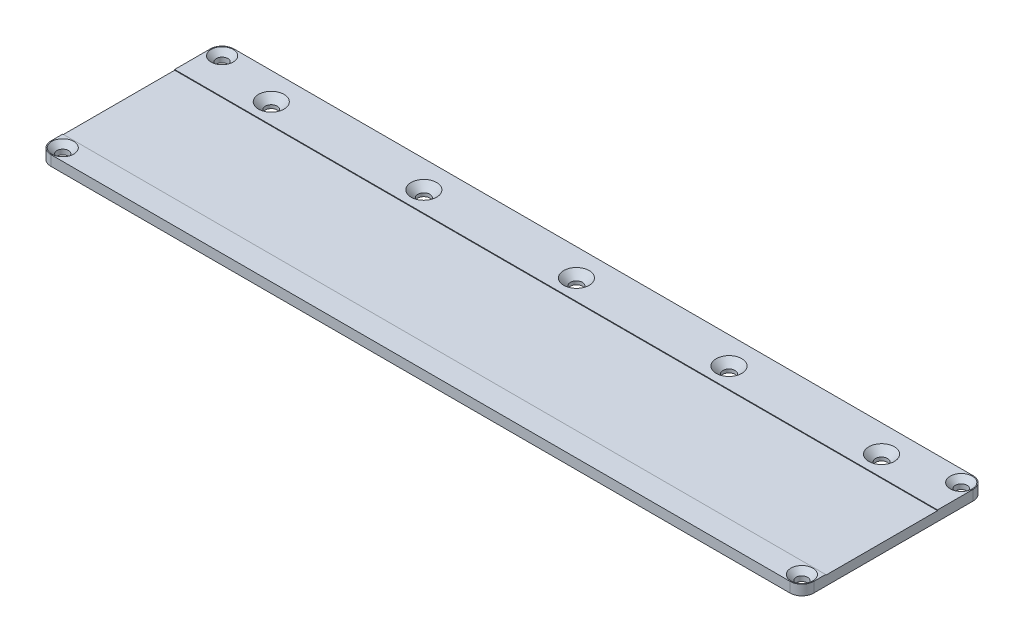
ISO-10303-21;
HEADER;
FILE_DESCRIPTION(('STEP AP214'),'2;1');
FILE_NAME('part.step','',(''),(''),'','','');
FILE_SCHEMA(('AUTOMOTIVE_DESIGN { 1 0 10303 214 1 1 1 1 }'));
ENDSEC;
DATA;
#1=APPLICATION_CONTEXT('core data for automotive mechanical design processes');
#2=APPLICATION_PROTOCOL_DEFINITION('international standard','automotive_design',2000,#1);
#3=PRODUCT_CONTEXT('',#1,'mechanical');
#4=PRODUCT('Part','Part','',(#3));
#5=PRODUCT_RELATED_PRODUCT_CATEGORY('part','',(#4));
#6=PRODUCT_DEFINITION_FORMATION('','',#4);
#7=PRODUCT_DEFINITION_CONTEXT('part definition',#1,'design');
#8=PRODUCT_DEFINITION('design','',#6,#7);
#9=PRODUCT_DEFINITION_SHAPE('','',#8);
#10=(LENGTH_UNIT() NAMED_UNIT(*) SI_UNIT(.MILLI.,.METRE.));
#11=(NAMED_UNIT(*) PLANE_ANGLE_UNIT() SI_UNIT($,.RADIAN.));
#12=(NAMED_UNIT(*) SI_UNIT($,.STERADIAN.) SOLID_ANGLE_UNIT());
#13=UNCERTAINTY_MEASURE_WITH_UNIT(LENGTH_MEASURE(1.E-05),#10,'distance_accuracy_value','');
#14=(GEOMETRIC_REPRESENTATION_CONTEXT(3) GLOBAL_UNCERTAINTY_ASSIGNED_CONTEXT((#13)) GLOBAL_UNIT_ASSIGNED_CONTEXT((#10,
#11,#12)) REPRESENTATION_CONTEXT('',''));
#15=CARTESIAN_POINT('',(0.,0.,0.));
#16=DIRECTION('',(0.,0.,1.));
#17=DIRECTION('',(1.,0.,0.));
#18=AXIS2_PLACEMENT_3D('',#15,#16,#17);
#19=CARTESIAN_POINT('',(-112.5,3.,0.));
#20=DIRECTION('',(-1.,0.,0.));
#21=DIRECTION('',(0.,0.,1.));
#22=AXIS2_PLACEMENT_3D('',#19,#20,#21);
#23=PLANE('',#22);
#24=DIRECTION('',(0.,0.,-1.));
#25=VECTOR('',#24,1.);
#26=CARTESIAN_POINT('',(-112.5,3.,0.));
#27=LINE('',#26,#25);
#28=CARTESIAN_POINT('',(-112.5,3.,-9.49999999999999));
#29=VERTEX_POINT('',#28);
#30=CARTESIAN_POINT('',(-112.5,3.,-20.));
#31=VERTEX_POINT('',#30);
#32=EDGE_CURVE('E191',#29,#31,#27,.T.);
#33=ORIENTED_EDGE('',*,*,#32,.T.);
#34=DIRECTION('',(0.,-1.,0.));
#35=VECTOR('',#34,1.);
#36=CARTESIAN_POINT('',(-112.5,3.,-20.));
#37=LINE('',#36,#35);
#38=CARTESIAN_POINT('',(-112.5,0.,-20.));
#39=VERTEX_POINT('',#38);
#40=EDGE_CURVE('E241',#31,#39,#37,.T.);
#41=ORIENTED_EDGE('',*,*,#40,.T.);
#42=DIRECTION('',(0.,0.,-1.));
#43=VECTOR('',#42,1.);
#44=CARTESIAN_POINT('',(-112.5,0.,0.));
#45=LINE('',#44,#43);
#46=CARTESIAN_POINT('',(-112.5,0.,27.));
#47=VERTEX_POINT('',#46);
#48=EDGE_CURVE('E198',#47,#39,#45,.T.);
#49=ORIENTED_EDGE('',*,*,#48,.F.);
#50=DIRECTION('',(0.,-1.,0.));
#51=VECTOR('',#50,1.);
#52=CARTESIAN_POINT('',(-112.5,3.,27.));
#53=LINE('',#52,#51);
#54=CARTESIAN_POINT('',(-112.5,3.,27.));
#55=VERTEX_POINT('',#54);
#56=EDGE_CURVE('E239',#47,#55,#53,.F.);
#57=ORIENTED_EDGE('',*,*,#56,.T.);
#58=CARTESIAN_POINT('',(-112.5,3.,23.5));
#59=VERTEX_POINT('',#58);
#60=EDGE_CURVE('E188',#55,#59,#27,.T.);
#61=ORIENTED_EDGE('',*,*,#60,.T.);
#62=DIRECTION('',(0.,1.,0.));
#63=VECTOR('',#62,1.);
#64=CARTESIAN_POINT('',(-112.5,2.8,23.5));
#65=LINE('',#64,#63);
#66=CARTESIAN_POINT('',(-112.5,2.8,23.5));
#67=VERTEX_POINT('',#66);
#68=EDGE_CURVE('E142',#67,#59,#65,.T.);
#69=ORIENTED_EDGE('',*,*,#68,.F.);
#70=DIRECTION('',(0.,0.,1.));
#71=VECTOR('',#70,1.);
#72=CARTESIAN_POINT('',(-112.5,2.8,0.));
#73=LINE('',#72,#71);
#74=CARTESIAN_POINT('',(-112.5,2.8,-9.49999999999999));
#75=VERTEX_POINT('',#74);
#76=EDGE_CURVE('E149',#75,#67,#73,.T.);
#77=ORIENTED_EDGE('',*,*,#76,.F.);
#78=DIRECTION('',(0.,1.,0.));
#79=VECTOR('',#78,1.);
#80=CARTESIAN_POINT('',(-112.5,2.8,-9.49999999999999));
#81=LINE('',#80,#79);
#82=EDGE_CURVE('E131',#75,#29,#81,.T.);
#83=ORIENTED_EDGE('',*,*,#82,.T.);
#84=EDGE_LOOP('',(#33,#41,#49,#57,#61,#69,#77,#83));
#85=FACE_BOUND('',#84,.T.);
#86=ADVANCED_FACE('F43',(#85),#23,.T.);
#87=CARTESIAN_POINT('',(112.5,3.,0.));
#88=DIRECTION('',(-1.,0.,0.));
#89=DIRECTION('',(0.,0.,1.));
#90=AXIS2_PLACEMENT_3D('',#87,#88,#89);
#91=PLANE('',#90);
#92=DIRECTION('',(0.,0.,-1.));
#93=VECTOR('',#92,1.);
#94=CARTESIAN_POINT('',(112.5,3.,0.));
#95=LINE('',#94,#93);
#96=CARTESIAN_POINT('',(112.5,3.,27.));
#97=VERTEX_POINT('',#96);
#98=CARTESIAN_POINT('',(112.5,3.,23.5));
#99=VERTEX_POINT('',#98);
#100=EDGE_CURVE('E192',#97,#99,#95,.T.);
#101=ORIENTED_EDGE('',*,*,#100,.F.);
#102=DIRECTION('',(0.,-1.,0.));
#103=VECTOR('',#102,1.);
#104=CARTESIAN_POINT('',(112.5,3.,27.));
#105=LINE('',#104,#103);
#106=CARTESIAN_POINT('',(112.5,0.,27.));
#107=VERTEX_POINT('',#106);
#108=EDGE_CURVE('E263',#97,#107,#105,.T.);
#109=ORIENTED_EDGE('',*,*,#108,.T.);
#110=DIRECTION('',(0.,0.,-1.));
#111=VECTOR('',#110,1.);
#112=CARTESIAN_POINT('',(112.5,0.,0.));
#113=LINE('',#112,#111);
#114=CARTESIAN_POINT('',(112.5,0.,-20.));
#115=VERTEX_POINT('',#114);
#116=EDGE_CURVE('E201',#107,#115,#113,.T.);
#117=ORIENTED_EDGE('',*,*,#116,.T.);
#118=DIRECTION('',(0.,-1.,0.));
#119=VECTOR('',#118,1.);
#120=CARTESIAN_POINT('',(112.5,3.,-20.));
#121=LINE('',#120,#119);
#122=CARTESIAN_POINT('',(112.5,3.,-20.));
#123=VERTEX_POINT('',#122);
#124=EDGE_CURVE('E261',#115,#123,#121,.F.);
#125=ORIENTED_EDGE('',*,*,#124,.T.);
#126=CARTESIAN_POINT('',(112.5,3.,-9.5));
#127=VERTEX_POINT('',#126);
#128=EDGE_CURVE('E190',#127,#123,#95,.T.);
#129=ORIENTED_EDGE('',*,*,#128,.F.);
#130=DIRECTION('',(0.,1.,0.));
#131=VECTOR('',#130,1.);
#132=CARTESIAN_POINT('',(112.5,2.8,-9.5));
#133=LINE('',#132,#131);
#134=CARTESIAN_POINT('',(112.5,2.8,-9.5));
#135=VERTEX_POINT('',#134);
#136=EDGE_CURVE('E166',#135,#127,#133,.T.);
#137=ORIENTED_EDGE('',*,*,#136,.F.);
#138=DIRECTION('',(0.,0.,-1.));
#139=VECTOR('',#138,1.);
#140=CARTESIAN_POINT('',(112.5,2.8,0.));
#141=LINE('',#140,#139);
#142=CARTESIAN_POINT('',(112.5,2.8,23.5));
#143=VERTEX_POINT('',#142);
#144=EDGE_CURVE('E143',#143,#135,#141,.T.);
#145=ORIENTED_EDGE('',*,*,#144,.F.);
#146=DIRECTION('',(0.,1.,0.));
#147=VECTOR('',#146,1.);
#148=CARTESIAN_POINT('',(112.5,2.8,23.5));
#149=LINE('',#148,#147);
#150=EDGE_CURVE('E169',#143,#99,#149,.T.);
#151=ORIENTED_EDGE('',*,*,#150,.T.);
#152=EDGE_LOOP('',(#101,#109,#117,#125,#129,#137,#145,#151));
#153=FACE_BOUND('',#152,.T.);
#154=ADVANCED_FACE('F283',(#153),#91,.F.);
#155=CARTESIAN_POINT('',(0.,3.,0.));
#156=DIRECTION('',(0.,1.,0.));
#157=DIRECTION('',(0.,0.,1.));
#158=AXIS2_PLACEMENT_3D('',#155,#156,#157);
#159=PLANE('',#158);
#160=CARTESIAN_POINT('',(109.,3.,-20.));
#161=DIRECTION('',(0.,1.,0.));
#162=DIRECTION('',(0.,0.,1.));
#163=AXIS2_PLACEMENT_3D('',#160,#161,#162);
#164=CIRCLE('',#163,3.25);
#165=CARTESIAN_POINT('',(109.,3.,-16.75));
#166=VERTEX_POINT('',#165);
#167=EDGE_CURVE('E720',#166,#166,#164,.T.);
#168=ORIENTED_EDGE('',*,*,#167,.F.);
#169=EDGE_LOOP('',(#168));
#170=FACE_BOUND('',#169,.T.);
#171=CARTESIAN_POINT('',(-109.,3.,-20.));
#172=DIRECTION('',(0.,1.,0.));
#173=DIRECTION('',(0.,0.,1.));
#174=AXIS2_PLACEMENT_3D('',#171,#172,#173);
#175=CIRCLE('',#174,3.25);
#176=CARTESIAN_POINT('',(-109.,3.,-16.75));
#177=VERTEX_POINT('',#176);
#178=EDGE_CURVE('E745',#177,#177,#175,.T.);
#179=ORIENTED_EDGE('',*,*,#178,.F.);
#180=EDGE_LOOP('',(#179));
#181=FACE_BOUND('',#180,.T.);
#182=CARTESIAN_POINT('',(90.,3.,-15.5));
#183=DIRECTION('',(0.,1.,0.));
#184=DIRECTION('',(0.,0.,1.));
#185=AXIS2_PLACEMENT_3D('',#182,#183,#184);
#186=CIRCLE('',#185,3.76776695296635);
#187=CARTESIAN_POINT('',(90.,3.,-11.7322330470337));
#188=VERTEX_POINT('',#187);
#189=EDGE_CURVE('E224',#188,#188,#186,.F.);
#190=ORIENTED_EDGE('',*,*,#189,.T.);
#191=EDGE_LOOP('',(#190));
#192=FACE_BOUND('',#191,.T.);
#193=CARTESIAN_POINT('',(45.,3.,-15.5));
#194=DIRECTION('',(0.,1.,0.));
#195=DIRECTION('',(0.,0.,1.));
#196=AXIS2_PLACEMENT_3D('',#193,#194,#195);
#197=CIRCLE('',#196,3.76776695296635);
#198=CARTESIAN_POINT('',(45.,3.,-11.7322330470337));
#199=VERTEX_POINT('',#198);
#200=EDGE_CURVE('E221',#199,#199,#197,.F.);
#201=ORIENTED_EDGE('',*,*,#200,.T.);
#202=EDGE_LOOP('',(#201));
#203=FACE_BOUND('',#202,.T.);
#204=CARTESIAN_POINT('',(0.,3.,-15.5));
#205=DIRECTION('',(0.,1.,0.));
#206=DIRECTION('',(0.,0.,1.));
#207=AXIS2_PLACEMENT_3D('',#204,#205,#206);
#208=CIRCLE('',#207,3.76776695296635);
#209=CARTESIAN_POINT('',(0.,3.,-11.7322330470337));
#210=VERTEX_POINT('',#209);
#211=EDGE_CURVE('E218',#210,#210,#208,.F.);
#212=ORIENTED_EDGE('',*,*,#211,.T.);
#213=EDGE_LOOP('',(#212));
#214=FACE_BOUND('',#213,.T.);
#215=CARTESIAN_POINT('',(-45.,3.,-15.5));
#216=DIRECTION('',(0.,1.,0.));
#217=DIRECTION('',(0.,0.,1.));
#218=AXIS2_PLACEMENT_3D('',#215,#216,#217);
#219=CIRCLE('',#218,3.76776695296635);
#220=CARTESIAN_POINT('',(-45.,3.,-11.7322330470337));
#221=VERTEX_POINT('',#220);
#222=EDGE_CURVE('E215',#221,#221,#219,.F.);
#223=ORIENTED_EDGE('',*,*,#222,.T.);
#224=EDGE_LOOP('',(#223));
#225=FACE_BOUND('',#224,.T.);
#226=CARTESIAN_POINT('',(-90.,3.,-15.5));
#227=DIRECTION('',(0.,1.,0.));
#228=DIRECTION('',(0.,0.,1.));
#229=AXIS2_PLACEMENT_3D('',#226,#227,#228);
#230=CIRCLE('',#229,3.76776695296635);
#231=CARTESIAN_POINT('',(-90.,3.,-11.7322330470337));
#232=VERTEX_POINT('',#231);
#233=EDGE_CURVE('E212',#232,#232,#230,.F.);
#234=ORIENTED_EDGE('',*,*,#233,.T.);
#235=EDGE_LOOP('',(#234));
#236=FACE_BOUND('',#235,.T.);
#237=DIRECTION('',(1.,0.,0.));
#238=VECTOR('',#237,1.);
#239=CARTESIAN_POINT('',(0.,3.,-23.5));
#240=LINE('',#239,#238);
#241=CARTESIAN_POINT('',(-109.,3.,-23.5));
#242=VERTEX_POINT('',#241);
#243=CARTESIAN_POINT('',(109.,3.,-23.5));
#244=VERTEX_POINT('',#243);
#245=EDGE_CURVE('E194',#242,#244,#240,.T.);
#246=ORIENTED_EDGE('',*,*,#245,.F.);
#247=CARTESIAN_POINT('',(-109.,3.,-20.));
#248=DIRECTION('',(0.,1.,0.));
#249=DIRECTION('',(0.,0.,1.));
#250=AXIS2_PLACEMENT_3D('',#247,#248,#249);
#251=CIRCLE('',#250,3.5);
#252=EDGE_CURVE('E259',#242,#31,#251,.T.);
#253=ORIENTED_EDGE('',*,*,#252,.T.);
#254=ORIENTED_EDGE('',*,*,#32,.F.);
#255=DIRECTION('',(1.,0.,0.));
#256=VECTOR('',#255,1.);
#257=CARTESIAN_POINT('',(0.,3.,-9.5));
#258=LINE('',#257,#256);
#259=EDGE_CURVE('E137',#29,#127,#258,.T.);
#260=ORIENTED_EDGE('',*,*,#259,.T.);
#261=ORIENTED_EDGE('',*,*,#128,.T.);
#262=CARTESIAN_POINT('',(109.,3.,-20.));
#263=DIRECTION('',(0.,1.,0.));
#264=DIRECTION('',(0.,0.,1.));
#265=AXIS2_PLACEMENT_3D('',#262,#263,#264);
#266=CIRCLE('',#265,3.5);
#267=EDGE_CURVE('E257',#123,#244,#266,.T.);
#268=ORIENTED_EDGE('',*,*,#267,.T.);
#269=EDGE_LOOP('',(#246,#253,#254,#260,#261,#268));
#270=FACE_BOUND('',#269,.T.);
#271=ADVANCED_FACE('F293',(#170,#181,#192,#203,#214,#225,#236,#270),#159,.T.);
#272=CARTESIAN_POINT('',(0.,3.,-23.5));
#273=DIRECTION('',(0.,0.,-1.));
#274=DIRECTION('',(-1.,0.,0.));
#275=AXIS2_PLACEMENT_3D('',#272,#273,#274);
#276=PLANE('',#275);
#277=DIRECTION('',(1.,0.,0.));
#278=VECTOR('',#277,1.);
#279=CARTESIAN_POINT('',(0.,0.,-23.5));
#280=LINE('',#279,#278);
#281=CARTESIAN_POINT('',(-109.,0.,-23.5));
#282=VERTEX_POINT('',#281);
#283=CARTESIAN_POINT('',(109.,0.,-23.5));
#284=VERTEX_POINT('',#283);
#285=EDGE_CURVE('E205',#282,#284,#280,.T.);
#286=ORIENTED_EDGE('',*,*,#285,.F.);
#287=DIRECTION('',(0.,-1.,0.));
#288=VECTOR('',#287,1.);
#289=CARTESIAN_POINT('',(-109.,3.,-23.5));
#290=LINE('',#289,#288);
#291=EDGE_CURVE('E255',#282,#242,#290,.F.);
#292=ORIENTED_EDGE('',*,*,#291,.T.);
#293=ORIENTED_EDGE('',*,*,#245,.T.);
#294=DIRECTION('',(0.,-1.,0.));
#295=VECTOR('',#294,1.);
#296=CARTESIAN_POINT('',(109.,0.,-23.5));
#297=LINE('',#296,#295);
#298=EDGE_CURVE('E252',#244,#284,#297,.T.);
#299=ORIENTED_EDGE('',*,*,#298,.T.);
#300=EDGE_LOOP('',(#286,#292,#293,#299));
#301=FACE_BOUND('',#300,.T.);
#302=ADVANCED_FACE('F302',(#301),#276,.T.);
#303=CARTESIAN_POINT('',(109.,3.,27.));
#304=DIRECTION('',(0.,1.,0.));
#305=DIRECTION('',(0.,0.,1.));
#306=AXIS2_PLACEMENT_3D('',#303,#304,#305);
#307=CIRCLE('',#306,3.25);
#308=CARTESIAN_POINT('',(109.,3.,30.25));
#309=VERTEX_POINT('',#308);
#310=EDGE_CURVE('E727',#309,#309,#307,.T.);
#311=ORIENTED_EDGE('',*,*,#310,.F.);
#312=EDGE_LOOP('',(#311));
#313=FACE_BOUND('',#312,.T.);
#314=CARTESIAN_POINT('',(-109.,3.,27.));
#315=DIRECTION('',(0.,1.,0.));
#316=DIRECTION('',(0.,0.,1.));
#317=AXIS2_PLACEMENT_3D('',#314,#315,#316);
#318=CIRCLE('',#317,3.25);
#319=CARTESIAN_POINT('',(-109.,3.,30.25));
#320=VERTEX_POINT('',#319);
#321=EDGE_CURVE('E736',#320,#320,#318,.T.);
#322=ORIENTED_EDGE('',*,*,#321,.F.);
#323=EDGE_LOOP('',(#322));
#324=FACE_BOUND('',#323,.T.);
#325=DIRECTION('',(1.,0.,0.));
#326=VECTOR('',#325,1.);
#327=CARTESIAN_POINT('',(-112.5,3.,30.5));
#328=LINE('',#327,#326);
#329=CARTESIAN_POINT('',(-109.,3.,30.5));
#330=VERTEX_POINT('',#329);
#331=CARTESIAN_POINT('',(109.,3.,30.5));
#332=VERTEX_POINT('',#331);
#333=EDGE_CURVE('E202',#330,#332,#328,.T.);
#334=ORIENTED_EDGE('',*,*,#333,.T.);
#335=CARTESIAN_POINT('',(109.,3.,27.));
#336=DIRECTION('',(0.,1.,0.));
#337=DIRECTION('',(0.,0.,1.));
#338=AXIS2_PLACEMENT_3D('',#335,#336,#337);
#339=CIRCLE('',#338,3.5);
#340=EDGE_CURVE('E11',#332,#97,#339,.T.);
#341=ORIENTED_EDGE('',*,*,#340,.T.);
#342=ORIENTED_EDGE('',*,*,#100,.T.);
#343=DIRECTION('',(1.,0.,0.));
#344=VECTOR('',#343,1.);
#345=CARTESIAN_POINT('',(0.,3.,23.5));
#346=LINE('',#345,#344);
#347=EDGE_CURVE('E153',#59,#99,#346,.T.);
#348=ORIENTED_EDGE('',*,*,#347,.F.);
#349=ORIENTED_EDGE('',*,*,#60,.F.);
#350=CARTESIAN_POINT('',(-109.,3.,27.));
#351=DIRECTION('',(0.,1.,0.));
#352=DIRECTION('',(0.,0.,1.));
#353=AXIS2_PLACEMENT_3D('',#350,#351,#352);
#354=CIRCLE('',#353,3.5);
#355=EDGE_CURVE('E51',#55,#330,#354,.T.);
#356=ORIENTED_EDGE('',*,*,#355,.T.);
#357=EDGE_LOOP('',(#334,#341,#342,#348,#349,#356));
#358=FACE_BOUND('',#357,.T.);
#359=ADVANCED_FACE('F286',(#313,#324,#358),#159,.T.);
#360=CARTESIAN_POINT('',(0.,0.,0.));
#361=DIRECTION('',(0.,1.,0.));
#362=DIRECTION('',(0.,0.,1.));
#363=AXIS2_PLACEMENT_3D('',#360,#361,#362);
#364=PLANE('',#363);
#365=CARTESIAN_POINT('',(109.,0.,-20.));
#366=DIRECTION('',(0.,1.,0.));
#367=DIRECTION('',(0.,0.,1.));
#368=AXIS2_PLACEMENT_3D('',#365,#366,#367);
#369=CIRCLE('',#368,1.69999999999999);
#370=CARTESIAN_POINT('',(109.,0.,-18.3));
#371=VERTEX_POINT('',#370);
#372=EDGE_CURVE('E722',#371,#371,#369,.T.);
#373=ORIENTED_EDGE('',*,*,#372,.T.);
#374=EDGE_LOOP('',(#373));
#375=FACE_BOUND('',#374,.T.);
#376=CARTESIAN_POINT('',(109.,0.,27.));
#377=DIRECTION('',(0.,1.,0.));
#378=DIRECTION('',(0.,0.,1.));
#379=AXIS2_PLACEMENT_3D('',#376,#377,#378);
#380=CIRCLE('',#379,1.69999999999999);
#381=CARTESIAN_POINT('',(109.,0.,28.7));
#382=VERTEX_POINT('',#381);
#383=EDGE_CURVE('E733',#382,#382,#380,.T.);
#384=ORIENTED_EDGE('',*,*,#383,.T.);
#385=EDGE_LOOP('',(#384));
#386=FACE_BOUND('',#385,.T.);
#387=CARTESIAN_POINT('',(-109.,0.,27.));
#388=DIRECTION('',(0.,1.,0.));
#389=DIRECTION('',(0.,0.,1.));
#390=AXIS2_PLACEMENT_3D('',#387,#388,#389);
#391=CIRCLE('',#390,1.69999999999999);
#392=CARTESIAN_POINT('',(-109.,0.,28.7));
#393=VERTEX_POINT('',#392);
#394=EDGE_CURVE('E742',#393,#393,#391,.T.);
#395=ORIENTED_EDGE('',*,*,#394,.T.);
#396=EDGE_LOOP('',(#395));
#397=FACE_BOUND('',#396,.T.);
#398=CARTESIAN_POINT('',(-109.,0.,-20.));
#399=DIRECTION('',(0.,1.,0.));
#400=DIRECTION('',(0.,0.,1.));
#401=AXIS2_PLACEMENT_3D('',#398,#399,#400);
#402=CIRCLE('',#401,1.69999999999999);
#403=CARTESIAN_POINT('',(-109.,0.,-18.3));
#404=VERTEX_POINT('',#403);
#405=EDGE_CURVE('E163',#404,#404,#402,.T.);
#406=ORIENTED_EDGE('',*,*,#405,.T.);
#407=EDGE_LOOP('',(#406));
#408=FACE_BOUND('',#407,.T.);
#409=CARTESIAN_POINT('',(-90.,0.,-15.5));
#410=DIRECTION('',(0.,1.,0.));
#411=DIRECTION('',(0.,0.,1.));
#412=AXIS2_PLACEMENT_3D('',#409,#410,#411);
#413=CIRCLE('',#412,1.76776695296638);
#414=CARTESIAN_POINT('',(-90.,0.,-13.7322330470336));
#415=VERTEX_POINT('',#414);
#416=EDGE_CURVE('E168',#415,#415,#413,.T.);
#417=ORIENTED_EDGE('',*,*,#416,.T.);
#418=EDGE_LOOP('',(#417));
#419=FACE_BOUND('',#418,.T.);
#420=CARTESIAN_POINT('',(-45.,0.,-15.5));
#421=DIRECTION('',(0.,1.,0.));
#422=DIRECTION('',(0.,0.,1.));
#423=AXIS2_PLACEMENT_3D('',#420,#421,#422);
#424=CIRCLE('',#423,1.76776695296637);
#425=CARTESIAN_POINT('',(-45.,0.,-13.7322330470336));
#426=VERTEX_POINT('',#425);
#427=EDGE_CURVE('E180',#426,#426,#424,.T.);
#428=ORIENTED_EDGE('',*,*,#427,.T.);
#429=EDGE_LOOP('',(#428));
#430=FACE_BOUND('',#429,.T.);
#431=CARTESIAN_POINT('',(90.,0.,-15.5));
#432=DIRECTION('',(0.,1.,0.));
#433=DIRECTION('',(0.,0.,1.));
#434=AXIS2_PLACEMENT_3D('',#431,#432,#433);
#435=CIRCLE('',#434,1.76776695296638);
#436=CARTESIAN_POINT('',(90.,0.,-13.7322330470336));
#437=VERTEX_POINT('',#436);
#438=EDGE_CURVE('E177',#437,#437,#435,.T.);
#439=ORIENTED_EDGE('',*,*,#438,.T.);
#440=EDGE_LOOP('',(#439));
#441=FACE_BOUND('',#440,.T.);
#442=CARTESIAN_POINT('',(45.,0.,-15.5));
#443=DIRECTION('',(0.,1.,0.));
#444=DIRECTION('',(0.,0.,1.));
#445=AXIS2_PLACEMENT_3D('',#442,#443,#444);
#446=CIRCLE('',#445,1.76776695296637);
#447=CARTESIAN_POINT('',(45.,0.,-13.7322330470336));
#448=VERTEX_POINT('',#447);
#449=EDGE_CURVE('E173',#448,#448,#446,.T.);
#450=ORIENTED_EDGE('',*,*,#449,.T.);
#451=EDGE_LOOP('',(#450));
#452=FACE_BOUND('',#451,.T.);
#453=CARTESIAN_POINT('',(0.,0.,-15.5));
#454=DIRECTION('',(0.,1.,0.));
#455=DIRECTION('',(0.,0.,1.));
#456=AXIS2_PLACEMENT_3D('',#453,#454,#455);
#457=CIRCLE('',#456,1.76776695296637);
#458=CARTESIAN_POINT('',(0.,0.,-13.7322330470336));
#459=VERTEX_POINT('',#458);
#460=EDGE_CURVE('E176',#459,#459,#457,.T.);
#461=ORIENTED_EDGE('',*,*,#460,.T.);
#462=EDGE_LOOP('',(#461));
#463=FACE_BOUND('',#462,.T.);
#464=ORIENTED_EDGE('',*,*,#48,.T.);
#465=CARTESIAN_POINT('',(-109.,0.,-20.));
#466=DIRECTION('',(0.,1.,0.));
#467=DIRECTION('',(0.,0.,1.));
#468=AXIS2_PLACEMENT_3D('',#465,#466,#467);
#469=CIRCLE('',#468,3.5);
#470=EDGE_CURVE('E250',#39,#282,#469,.F.);
#471=ORIENTED_EDGE('',*,*,#470,.T.);
#472=ORIENTED_EDGE('',*,*,#285,.T.);
#473=CARTESIAN_POINT('',(109.,0.,-20.));
#474=DIRECTION('',(0.,1.,0.));
#475=DIRECTION('',(0.,0.,1.));
#476=AXIS2_PLACEMENT_3D('',#473,#474,#475);
#477=CIRCLE('',#476,3.5);
#478=EDGE_CURVE('E244',#284,#115,#477,.F.);
#479=ORIENTED_EDGE('',*,*,#478,.T.);
#480=ORIENTED_EDGE('',*,*,#116,.F.);
#481=CARTESIAN_POINT('',(109.,0.,27.));
#482=DIRECTION('',(0.,1.,0.));
#483=DIRECTION('',(0.,0.,1.));
#484=AXIS2_PLACEMENT_3D('',#481,#482,#483);
#485=CIRCLE('',#484,3.5);
#486=CARTESIAN_POINT('',(109.,0.,30.5));
#487=VERTEX_POINT('',#486);
#488=EDGE_CURVE('E248',#107,#487,#485,.F.);
#489=ORIENTED_EDGE('',*,*,#488,.T.);
#490=DIRECTION('',(1.,0.,0.));
#491=VECTOR('',#490,1.);
#492=CARTESIAN_POINT('',(-112.5,0.,30.5));
#493=LINE('',#492,#491);
#494=CARTESIAN_POINT('',(-109.,0.,30.5));
#495=VERTEX_POINT('',#494);
#496=EDGE_CURVE('E187',#495,#487,#493,.T.);
#497=ORIENTED_EDGE('',*,*,#496,.F.);
#498=CARTESIAN_POINT('',(-109.,0.,27.));
#499=DIRECTION('',(0.,1.,0.));
#500=DIRECTION('',(0.,0.,1.));
#501=AXIS2_PLACEMENT_3D('',#498,#499,#500);
#502=CIRCLE('',#501,3.5);
#503=EDGE_CURVE('E246',#495,#47,#502,.F.);
#504=ORIENTED_EDGE('',*,*,#503,.T.);
#505=EDGE_LOOP('',(#464,#471,#472,#479,#480,#489,#497,#504));
#506=FACE_BOUND('',#505,.T.);
#507=ADVANCED_FACE('F274',(#375,#386,#397,#408,#419,#430,#441,#452,#463,#506),#364,.F.);
#508=CARTESIAN_POINT('',(-112.5,3.,30.5));
#509=DIRECTION('',(0.,0.,-1.));
#510=DIRECTION('',(-1.,0.,0.));
#511=AXIS2_PLACEMENT_3D('',#508,#509,#510);
#512=PLANE('',#511);
#513=ORIENTED_EDGE('',*,*,#496,.T.);
#514=DIRECTION('',(0.,-1.,0.));
#515=VECTOR('',#514,1.);
#516=CARTESIAN_POINT('',(109.,3.,30.5));
#517=LINE('',#516,#515);
#518=EDGE_CURVE('E58',#487,#332,#517,.F.);
#519=ORIENTED_EDGE('',*,*,#518,.T.);
#520=ORIENTED_EDGE('',*,*,#333,.F.);
#521=DIRECTION('',(0.,-1.,0.));
#522=VECTOR('',#521,1.);
#523=CARTESIAN_POINT('',(-109.,0.,30.5));
#524=LINE('',#523,#522);
#525=EDGE_CURVE('E266',#330,#495,#524,.T.);
#526=ORIENTED_EDGE('',*,*,#525,.T.);
#527=EDGE_LOOP('',(#513,#519,#520,#526));
#528=FACE_BOUND('',#527,.T.);
#529=ADVANCED_FACE('F271',(#528),#512,.F.);
#530=CARTESIAN_POINT('',(0.,0.,-15.5));
#531=DIRECTION('',(0.,1.,0.));
#532=DIRECTION('',(0.,0.,1.));
#533=AXIS2_PLACEMENT_3D('',#530,#531,#532);
#534=CYLINDRICAL_SURFACE('',#533,1.76776695296637);
#535=CARTESIAN_POINT('',(0.,1.00000000000001,-15.5));
#536=DIRECTION('',(0.,1.,0.));
#537=DIRECTION('',(0.,0.,1.));
#538=AXIS2_PLACEMENT_3D('',#535,#536,#537);
#539=CIRCLE('',#538,1.76776695296637);
#540=CARTESIAN_POINT('',(0.,1.00000000000001,-13.7322330470336));
#541=VERTEX_POINT('',#540);
#542=EDGE_CURVE('E230',#541,#541,#539,.T.);
#543=ORIENTED_EDGE('',*,*,#542,.T.);
#544=EDGE_LOOP('',(#543));
#545=FACE_BOUND('',#544,.T.);
#546=ORIENTED_EDGE('',*,*,#460,.F.);
#547=EDGE_LOOP('',(#546));
#548=FACE_BOUND('',#547,.T.);
#549=ADVANCED_FACE('F325',(#545,#548),#534,.F.);
#550=CARTESIAN_POINT('',(45.,0.,-15.5));
#551=DIRECTION('',(0.,1.,0.));
#552=DIRECTION('',(0.,0.,1.));
#553=AXIS2_PLACEMENT_3D('',#550,#551,#552);
#554=CYLINDRICAL_SURFACE('',#553,1.76776695296637);
#555=CARTESIAN_POINT('',(45.,1.00000000000001,-15.5));
#556=DIRECTION('',(0.,1.,0.));
#557=DIRECTION('',(0.,0.,1.));
#558=AXIS2_PLACEMENT_3D('',#555,#556,#557);
#559=CIRCLE('',#558,1.76776695296637);
#560=CARTESIAN_POINT('',(45.,1.00000000000001,-13.7322330470336));
#561=VERTEX_POINT('',#560);
#562=EDGE_CURVE('E227',#561,#561,#559,.T.);
#563=ORIENTED_EDGE('',*,*,#562,.T.);
#564=EDGE_LOOP('',(#563));
#565=FACE_BOUND('',#564,.T.);
#566=ORIENTED_EDGE('',*,*,#449,.F.);
#567=EDGE_LOOP('',(#566));
#568=FACE_BOUND('',#567,.T.);
#569=ADVANCED_FACE('F615',(#565,#568),#554,.F.);
#570=CARTESIAN_POINT('',(90.,0.,-15.5));
#571=DIRECTION('',(0.,1.,0.));
#572=DIRECTION('',(0.,0.,1.));
#573=AXIS2_PLACEMENT_3D('',#570,#571,#572);
#574=CYLINDRICAL_SURFACE('',#573,1.76776695296638);
#575=CARTESIAN_POINT('',(90.,0.999999999999993,-15.5));
#576=DIRECTION('',(0.,1.,0.));
#577=DIRECTION('',(0.,0.,1.));
#578=AXIS2_PLACEMENT_3D('',#575,#576,#577);
#579=CIRCLE('',#578,1.76776695296638);
#580=CARTESIAN_POINT('',(90.,0.999999999999993,-13.7322330470336));
#581=VERTEX_POINT('',#580);
#582=EDGE_CURVE('E197',#581,#581,#579,.T.);
#583=ORIENTED_EDGE('',*,*,#582,.T.);
#584=EDGE_LOOP('',(#583));
#585=FACE_BOUND('',#584,.T.);
#586=ORIENTED_EDGE('',*,*,#438,.F.);
#587=EDGE_LOOP('',(#586));
#588=FACE_BOUND('',#587,.T.);
#589=ADVANCED_FACE('F605',(#585,#588),#574,.F.);
#590=CARTESIAN_POINT('',(-45.,0.,-15.5));
#591=DIRECTION('',(0.,1.,0.));
#592=DIRECTION('',(0.,0.,1.));
#593=AXIS2_PLACEMENT_3D('',#590,#591,#592);
#594=CYLINDRICAL_SURFACE('',#593,1.76776695296637);
#595=CARTESIAN_POINT('',(-45.,1.00000000000001,-15.5));
#596=DIRECTION('',(0.,1.,0.));
#597=DIRECTION('',(0.,0.,1.));
#598=AXIS2_PLACEMENT_3D('',#595,#596,#597);
#599=CIRCLE('',#598,1.76776695296637);
#600=CARTESIAN_POINT('',(-45.,1.00000000000001,-13.7322330470336));
#601=VERTEX_POINT('',#600);
#602=EDGE_CURVE('E233',#601,#601,#599,.T.);
#603=ORIENTED_EDGE('',*,*,#602,.T.);
#604=EDGE_LOOP('',(#603));
#605=FACE_BOUND('',#604,.T.);
#606=ORIENTED_EDGE('',*,*,#427,.F.);
#607=EDGE_LOOP('',(#606));
#608=FACE_BOUND('',#607,.T.);
#609=ADVANCED_FACE('F595',(#605,#608),#594,.F.);
#610=CARTESIAN_POINT('',(-90.,0.,-15.5));
#611=DIRECTION('',(0.,1.,0.));
#612=DIRECTION('',(0.,0.,1.));
#613=AXIS2_PLACEMENT_3D('',#610,#611,#612);
#614=CYLINDRICAL_SURFACE('',#613,1.76776695296638);
#615=CARTESIAN_POINT('',(-90.,0.999999999999993,-15.5));
#616=DIRECTION('',(0.,1.,0.));
#617=DIRECTION('',(0.,0.,1.));
#618=AXIS2_PLACEMENT_3D('',#615,#616,#617);
#619=CIRCLE('',#618,1.76776695296638);
#620=CARTESIAN_POINT('',(-90.,0.999999999999993,-13.7322330470336));
#621=VERTEX_POINT('',#620);
#622=EDGE_CURVE('E236',#621,#621,#619,.T.);
#623=ORIENTED_EDGE('',*,*,#622,.T.);
#624=EDGE_LOOP('',(#623));
#625=FACE_BOUND('',#624,.T.);
#626=ORIENTED_EDGE('',*,*,#416,.F.);
#627=EDGE_LOOP('',(#626));
#628=FACE_BOUND('',#627,.T.);
#629=ADVANCED_FACE('F334',(#625,#628),#614,.F.);
#630=CARTESIAN_POINT('',(90.,0.999999999999993,-15.5));
#631=DIRECTION('',(0.,1.,0.));
#632=DIRECTION('',(0.,0.,1.));
#633=AXIS2_PLACEMENT_3D('',#630,#631,#632);
#634=CONICAL_SURFACE('',#633,1.76776695296638,0.78539816339744);
#635=ORIENTED_EDGE('',*,*,#189,.F.);
#636=EDGE_LOOP('',(#635));
#637=FACE_BOUND('',#636,.T.);
#638=ORIENTED_EDGE('',*,*,#582,.F.);
#639=EDGE_LOOP('',(#638));
#640=FACE_BOUND('',#639,.T.);
#641=ADVANCED_FACE('F327',(#637,#640),#634,.F.);
#642=CARTESIAN_POINT('',(45.,1.00000000000001,-15.5));
#643=DIRECTION('',(0.,1.,0.));
#644=DIRECTION('',(0.,0.,1.));
#645=AXIS2_PLACEMENT_3D('',#642,#643,#644);
#646=CONICAL_SURFACE('',#645,1.76776695296637,0.785398163397447);
#647=ORIENTED_EDGE('',*,*,#200,.F.);
#648=EDGE_LOOP('',(#647));
#649=FACE_BOUND('',#648,.T.);
#650=ORIENTED_EDGE('',*,*,#562,.F.);
#651=EDGE_LOOP('',(#650));
#652=FACE_BOUND('',#651,.T.);
#653=ADVANCED_FACE('F333',(#649,#652),#646,.F.);
#654=CARTESIAN_POINT('',(0.,1.00000000000001,-15.5));
#655=DIRECTION('',(0.,1.,0.));
#656=DIRECTION('',(0.,0.,1.));
#657=AXIS2_PLACEMENT_3D('',#654,#655,#656);
#658=CONICAL_SURFACE('',#657,1.76776695296637,0.785398163397447);
#659=ORIENTED_EDGE('',*,*,#211,.F.);
#660=EDGE_LOOP('',(#659));
#661=FACE_BOUND('',#660,.T.);
#662=ORIENTED_EDGE('',*,*,#542,.F.);
#663=EDGE_LOOP('',(#662));
#664=FACE_BOUND('',#663,.T.);
#665=ADVANCED_FACE('F341',(#661,#664),#658,.F.);
#666=CARTESIAN_POINT('',(-45.,1.00000000000001,-15.5));
#667=DIRECTION('',(0.,1.,0.));
#668=DIRECTION('',(0.,0.,1.));
#669=AXIS2_PLACEMENT_3D('',#666,#667,#668);
#670=CONICAL_SURFACE('',#669,1.76776695296637,0.785398163397447);
#671=ORIENTED_EDGE('',*,*,#222,.F.);
#672=EDGE_LOOP('',(#671));
#673=FACE_BOUND('',#672,.T.);
#674=ORIENTED_EDGE('',*,*,#602,.F.);
#675=EDGE_LOOP('',(#674));
#676=FACE_BOUND('',#675,.T.);
#677=ADVANCED_FACE('F348',(#673,#676),#670,.F.);
#678=CARTESIAN_POINT('',(-90.,0.999999999999993,-15.5));
#679=DIRECTION('',(0.,1.,0.));
#680=DIRECTION('',(0.,0.,1.));
#681=AXIS2_PLACEMENT_3D('',#678,#679,#680);
#682=CONICAL_SURFACE('',#681,1.76776695296638,0.78539816339744);
#683=ORIENTED_EDGE('',*,*,#233,.F.);
#684=EDGE_LOOP('',(#683));
#685=FACE_BOUND('',#684,.T.);
#686=ORIENTED_EDGE('',*,*,#622,.F.);
#687=EDGE_LOOP('',(#686));
#688=FACE_BOUND('',#687,.T.);
#689=ADVANCED_FACE('F355',(#685,#688),#682,.F.);
#690=CARTESIAN_POINT('',(0.,2.8,-9.5));
#691=DIRECTION('',(0.,0.,1.));
#692=DIRECTION('',(1.,0.,0.));
#693=AXIS2_PLACEMENT_3D('',#690,#691,#692);
#694=PLANE('',#693);
#695=ORIENTED_EDGE('',*,*,#259,.F.);
#696=ORIENTED_EDGE('',*,*,#82,.F.);
#697=DIRECTION('',(1.,0.,0.));
#698=VECTOR('',#697,1.);
#699=CARTESIAN_POINT('',(0.,2.8,-9.5));
#700=LINE('',#699,#698);
#701=EDGE_CURVE('E134',#75,#135,#700,.T.);
#702=ORIENTED_EDGE('',*,*,#701,.T.);
#703=ORIENTED_EDGE('',*,*,#136,.T.);
#704=EDGE_LOOP('',(#695,#696,#702,#703));
#705=FACE_BOUND('',#704,.T.);
#706=ADVANCED_FACE('F133',(#705),#694,.T.);
#707=CARTESIAN_POINT('',(0.,2.8,23.5));
#708=DIRECTION('',(0.,0.,1.));
#709=DIRECTION('',(1.,0.,0.));
#710=AXIS2_PLACEMENT_3D('',#707,#708,#709);
#711=PLANE('',#710);
#712=ORIENTED_EDGE('',*,*,#347,.T.);
#713=ORIENTED_EDGE('',*,*,#150,.F.);
#714=DIRECTION('',(1.,0.,0.));
#715=VECTOR('',#714,1.);
#716=CARTESIAN_POINT('',(0.,2.8,23.5));
#717=LINE('',#716,#715);
#718=EDGE_CURVE('E156',#67,#143,#717,.T.);
#719=ORIENTED_EDGE('',*,*,#718,.F.);
#720=ORIENTED_EDGE('',*,*,#68,.T.);
#721=EDGE_LOOP('',(#712,#713,#719,#720));
#722=FACE_BOUND('',#721,.T.);
#723=ADVANCED_FACE('F288',(#722),#711,.F.);
#724=CARTESIAN_POINT('',(0.,2.8,0.));
#725=DIRECTION('',(0.,1.,0.));
#726=DIRECTION('',(0.,0.,1.));
#727=AXIS2_PLACEMENT_3D('',#724,#725,#726);
#728=PLANE('',#727);
#729=ORIENTED_EDGE('',*,*,#701,.F.);
#730=ORIENTED_EDGE('',*,*,#76,.T.);
#731=ORIENTED_EDGE('',*,*,#718,.T.);
#732=ORIENTED_EDGE('',*,*,#144,.T.);
#733=EDGE_LOOP('',(#729,#730,#731,#732));
#734=FACE_BOUND('',#733,.T.);
#735=ADVANCED_FACE('F147',(#734),#728,.T.);
#736=CARTESIAN_POINT('',(-109.,3.,-20.));
#737=DIRECTION('',(0.,-1.,0.));
#738=DIRECTION('',(0.,0.,-1.));
#739=AXIS2_PLACEMENT_3D('',#736,#737,#738);
#740=CYLINDRICAL_SURFACE('',#739,3.5);
#741=ORIENTED_EDGE('',*,*,#252,.F.);
#742=ORIENTED_EDGE('',*,*,#291,.F.);
#743=ORIENTED_EDGE('',*,*,#470,.F.);
#744=ORIENTED_EDGE('',*,*,#40,.F.);
#745=EDGE_LOOP('',(#741,#742,#743,#744));
#746=FACE_BOUND('',#745,.T.);
#747=ADVANCED_FACE('F298',(#746),#740,.T.);
#748=CARTESIAN_POINT('',(109.,3.,27.));
#749=DIRECTION('',(0.,-1.,0.));
#750=DIRECTION('',(0.,0.,-1.));
#751=AXIS2_PLACEMENT_3D('',#748,#749,#750);
#752=CYLINDRICAL_SURFACE('',#751,3.5);
#753=ORIENTED_EDGE('',*,*,#340,.F.);
#754=ORIENTED_EDGE('',*,*,#518,.F.);
#755=ORIENTED_EDGE('',*,*,#488,.F.);
#756=ORIENTED_EDGE('',*,*,#108,.F.);
#757=EDGE_LOOP('',(#753,#754,#755,#756));
#758=FACE_BOUND('',#757,.T.);
#759=ADVANCED_FACE('F280',(#758),#752,.T.);
#760=CARTESIAN_POINT('',(-109.,3.,27.));
#761=DIRECTION('',(0.,1.,0.));
#762=DIRECTION('',(0.,0.,1.));
#763=AXIS2_PLACEMENT_3D('',#760,#761,#762);
#764=CYLINDRICAL_SURFACE('',#763,3.5);
#765=ORIENTED_EDGE('',*,*,#355,.F.);
#766=ORIENTED_EDGE('',*,*,#56,.F.);
#767=ORIENTED_EDGE('',*,*,#503,.F.);
#768=ORIENTED_EDGE('',*,*,#525,.F.);
#769=EDGE_LOOP('',(#765,#766,#767,#768));
#770=FACE_BOUND('',#769,.T.);
#771=ADVANCED_FACE('F307',(#770),#764,.T.);
#772=CARTESIAN_POINT('',(109.,3.,-20.));
#773=DIRECTION('',(0.,1.,0.));
#774=DIRECTION('',(0.,0.,1.));
#775=AXIS2_PLACEMENT_3D('',#772,#773,#774);
#776=CYLINDRICAL_SURFACE('',#775,3.5);
#777=ORIENTED_EDGE('',*,*,#267,.F.);
#778=ORIENTED_EDGE('',*,*,#124,.F.);
#779=ORIENTED_EDGE('',*,*,#478,.F.);
#780=ORIENTED_EDGE('',*,*,#298,.F.);
#781=EDGE_LOOP('',(#777,#778,#779,#780));
#782=FACE_BOUND('',#781,.T.);
#783=ADVANCED_FACE('F45',(#782),#776,.T.);
#784=CARTESIAN_POINT('',(-109.,3.,-20.));
#785=DIRECTION('',(0.,1.,0.));
#786=DIRECTION('',(0.,0.,1.));
#787=AXIS2_PLACEMENT_3D('',#784,#785,#786);
#788=CYLINDRICAL_SURFACE('',#787,1.69999999999999);
#789=ORIENTED_EDGE('',*,*,#405,.F.);
#790=EDGE_LOOP('',(#789));
#791=FACE_BOUND('',#790,.T.);
#792=CARTESIAN_POINT('',(-109.,1.45,-20.));
#793=DIRECTION('',(0.,1.,0.));
#794=DIRECTION('',(0.,0.,1.));
#795=AXIS2_PLACEMENT_3D('',#792,#793,#794);
#796=CIRCLE('',#795,1.69999999999999);
#797=CARTESIAN_POINT('',(-109.,1.45,-18.3));
#798=VERTEX_POINT('',#797);
#799=EDGE_CURVE('E748',#798,#798,#796,.T.);
#800=ORIENTED_EDGE('',*,*,#799,.T.);
#801=EDGE_LOOP('',(#800));
#802=FACE_BOUND('',#801,.T.);
#803=ADVANCED_FACE('F306',(#791,#802),#788,.F.);
#804=CARTESIAN_POINT('',(-109.,3.,-20.));
#805=DIRECTION('',(0.,1.,0.));
#806=DIRECTION('',(0.,0.,1.));
#807=AXIS2_PLACEMENT_3D('',#804,#805,#806);
#808=CONICAL_SURFACE('',#807,3.25,0.785398163397451);
#809=ORIENTED_EDGE('',*,*,#799,.F.);
#810=EDGE_LOOP('',(#809));
#811=FACE_BOUND('',#810,.T.);
#812=ORIENTED_EDGE('',*,*,#178,.T.);
#813=EDGE_LOOP('',(#812));
#814=FACE_BOUND('',#813,.T.);
#815=ADVANCED_FACE('F312',(#811,#814),#808,.F.);
#816=CARTESIAN_POINT('',(-109.,3.,27.));
#817=DIRECTION('',(0.,1.,0.));
#818=DIRECTION('',(0.,0.,1.));
#819=AXIS2_PLACEMENT_3D('',#816,#817,#818);
#820=CYLINDRICAL_SURFACE('',#819,1.69999999999999);
#821=ORIENTED_EDGE('',*,*,#394,.F.);
#822=EDGE_LOOP('',(#821));
#823=FACE_BOUND('',#822,.T.);
#824=CARTESIAN_POINT('',(-109.,1.45,27.));
#825=DIRECTION('',(0.,1.,0.));
#826=DIRECTION('',(0.,0.,1.));
#827=AXIS2_PLACEMENT_3D('',#824,#825,#826);
#828=CIRCLE('',#827,1.69999999999999);
#829=CARTESIAN_POINT('',(-109.,1.45,28.7));
#830=VERTEX_POINT('',#829);
#831=EDGE_CURVE('E739',#830,#830,#828,.T.);
#832=ORIENTED_EDGE('',*,*,#831,.T.);
#833=EDGE_LOOP('',(#832));
#834=FACE_BOUND('',#833,.T.);
#835=ADVANCED_FACE('F430',(#823,#834),#820,.F.);
#836=CARTESIAN_POINT('',(-109.,3.,27.));
#837=DIRECTION('',(0.,1.,0.));
#838=DIRECTION('',(0.,0.,1.));
#839=AXIS2_PLACEMENT_3D('',#836,#837,#838);
#840=CONICAL_SURFACE('',#839,3.25,0.785398163397451);
#841=ORIENTED_EDGE('',*,*,#831,.F.);
#842=EDGE_LOOP('',(#841));
#843=FACE_BOUND('',#842,.T.);
#844=ORIENTED_EDGE('',*,*,#321,.T.);
#845=EDGE_LOOP('',(#844));
#846=FACE_BOUND('',#845,.T.);
#847=ADVANCED_FACE('F441',(#843,#846),#840,.F.);
#848=CARTESIAN_POINT('',(109.,3.,27.));
#849=DIRECTION('',(0.,1.,0.));
#850=DIRECTION('',(0.,0.,1.));
#851=AXIS2_PLACEMENT_3D('',#848,#849,#850);
#852=CYLINDRICAL_SURFACE('',#851,1.69999999999999);
#853=ORIENTED_EDGE('',*,*,#383,.F.);
#854=EDGE_LOOP('',(#853));
#855=FACE_BOUND('',#854,.T.);
#856=CARTESIAN_POINT('',(109.,1.45,27.));
#857=DIRECTION('',(0.,1.,0.));
#858=DIRECTION('',(0.,0.,1.));
#859=AXIS2_PLACEMENT_3D('',#856,#857,#858);
#860=CIRCLE('',#859,1.69999999999999);
#861=CARTESIAN_POINT('',(109.,1.45,28.7));
#862=VERTEX_POINT('',#861);
#863=EDGE_CURVE('E730',#862,#862,#860,.T.);
#864=ORIENTED_EDGE('',*,*,#863,.T.);
#865=EDGE_LOOP('',(#864));
#866=FACE_BOUND('',#865,.T.);
#867=ADVANCED_FACE('F452',(#855,#866),#852,.F.);
#868=CARTESIAN_POINT('',(109.,3.,27.));
#869=DIRECTION('',(0.,1.,0.));
#870=DIRECTION('',(0.,0.,1.));
#871=AXIS2_PLACEMENT_3D('',#868,#869,#870);
#872=CONICAL_SURFACE('',#871,3.25,0.785398163397451);
#873=ORIENTED_EDGE('',*,*,#863,.F.);
#874=EDGE_LOOP('',(#873));
#875=FACE_BOUND('',#874,.T.);
#876=ORIENTED_EDGE('',*,*,#310,.T.);
#877=EDGE_LOOP('',(#876));
#878=FACE_BOUND('',#877,.T.);
#879=ADVANCED_FACE('F463',(#875,#878),#872,.F.);
#880=CARTESIAN_POINT('',(109.,3.,-20.));
#881=DIRECTION('',(0.,1.,0.));
#882=DIRECTION('',(0.,0.,1.));
#883=AXIS2_PLACEMENT_3D('',#880,#881,#882);
#884=CYLINDRICAL_SURFACE('',#883,1.69999999999999);
#885=ORIENTED_EDGE('',*,*,#372,.F.);
#886=EDGE_LOOP('',(#885));
#887=FACE_BOUND('',#886,.T.);
#888=CARTESIAN_POINT('',(109.,1.45,-20.));
#889=DIRECTION('',(0.,1.,0.));
#890=DIRECTION('',(0.,0.,1.));
#891=AXIS2_PLACEMENT_3D('',#888,#889,#890);
#892=CIRCLE('',#891,1.69999999999999);
#893=CARTESIAN_POINT('',(109.,1.45,-18.3));
#894=VERTEX_POINT('',#893);
#895=EDGE_CURVE('E717',#894,#894,#892,.T.);
#896=ORIENTED_EDGE('',*,*,#895,.T.);
#897=EDGE_LOOP('',(#896));
#898=FACE_BOUND('',#897,.T.);
#899=ADVANCED_FACE('F474',(#887,#898),#884,.F.);
#900=CARTESIAN_POINT('',(109.,3.,-20.));
#901=DIRECTION('',(0.,1.,0.));
#902=DIRECTION('',(0.,0.,1.));
#903=AXIS2_PLACEMENT_3D('',#900,#901,#902);
#904=CONICAL_SURFACE('',#903,3.25,0.785398163397451);
#905=ORIENTED_EDGE('',*,*,#895,.F.);
#906=EDGE_LOOP('',(#905));
#907=FACE_BOUND('',#906,.T.);
#908=ORIENTED_EDGE('',*,*,#167,.T.);
#909=EDGE_LOOP('',(#908));
#910=FACE_BOUND('',#909,.T.);
#911=ADVANCED_FACE('F485',(#907,#910),#904,.F.);
#912=CLOSED_SHELL('',(#86,#154,#271,#302,#359,#507,#529,#549,#569,#589,#609,#629,#641,#653,#665,
#677,#689,#706,#723,#735,#747,#759,#771,#783,#803,#815,#835,#847,#867,#879,#899,#911));
#913=MANIFOLD_SOLID_BREP('B2',#912);
#914=ADVANCED_BREP_SHAPE_REPRESENTATION('',(#18,#913),#14);
#915=SHAPE_DEFINITION_REPRESENTATION(#9,#914);
ENDSEC;
END-ISO-10303-21;
